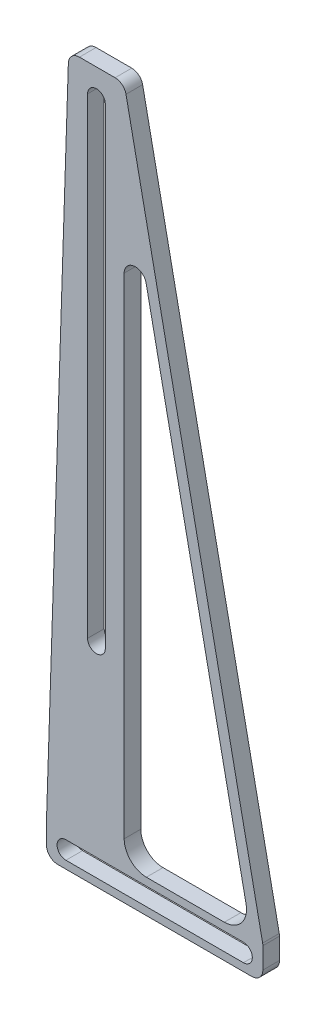
ISO-10303-21;
HEADER;
FILE_DESCRIPTION(('STEP AP214'),'2;1');
FILE_NAME('part.step','',(''),(''),'','','');
FILE_SCHEMA(('AUTOMOTIVE_DESIGN { 1 0 10303 214 1 1 1 1 }'));
ENDSEC;
DATA;
#1=APPLICATION_CONTEXT('core data for automotive mechanical design processes');
#2=APPLICATION_PROTOCOL_DEFINITION('international standard','automotive_design',2000,#1);
#3=PRODUCT_CONTEXT('',#1,'mechanical');
#4=PRODUCT('Part','Part','',(#3));
#5=PRODUCT_RELATED_PRODUCT_CATEGORY('part','',(#4));
#6=PRODUCT_DEFINITION_FORMATION('','',#4);
#7=PRODUCT_DEFINITION_CONTEXT('part definition',#1,'design');
#8=PRODUCT_DEFINITION('design','',#6,#7);
#9=PRODUCT_DEFINITION_SHAPE('','',#8);
#10=(LENGTH_UNIT() NAMED_UNIT(*) SI_UNIT(.MILLI.,.METRE.));
#11=(NAMED_UNIT(*) PLANE_ANGLE_UNIT() SI_UNIT($,.RADIAN.));
#12=(NAMED_UNIT(*) SI_UNIT($,.STERADIAN.) SOLID_ANGLE_UNIT());
#13=UNCERTAINTY_MEASURE_WITH_UNIT(LENGTH_MEASURE(1.E-05),#10,'distance_accuracy_value','');
#14=(GEOMETRIC_REPRESENTATION_CONTEXT(3) GLOBAL_UNCERTAINTY_ASSIGNED_CONTEXT((#13)) GLOBAL_UNIT_ASSIGNED_CONTEXT((#10,
#11,#12)) REPRESENTATION_CONTEXT('',''));
#15=CARTESIAN_POINT('',(0.,0.,0.));
#16=DIRECTION('',(0.,0.,1.));
#17=DIRECTION('',(1.,0.,0.));
#18=AXIS2_PLACEMENT_3D('',#15,#16,#17);
#19=CARTESIAN_POINT('',(0.,0.,3.));
#20=DIRECTION('',(0.,0.,1.));
#21=DIRECTION('',(1.,0.,0.));
#22=AXIS2_PLACEMENT_3D('',#19,#20,#21);
#23=PLANE('',#22);
#24=DIRECTION('',(-1.,0.,0.));
#25=VECTOR('',#24,1.);
#26=CARTESIAN_POINT('',(39.,6.,3.));
#27=LINE('',#26,#25);
#28=CARTESIAN_POINT('',(32.0556490686373,6.,3.));
#29=VERTEX_POINT('',#28);
#30=CARTESIAN_POINT('',(18.,6.,3.));
#31=VERTEX_POINT('',#30);
#32=EDGE_CURVE('E291',#29,#31,#27,.T.);
#33=ORIENTED_EDGE('',*,*,#32,.T.);
#34=CARTESIAN_POINT('',(18.,10.,3.));
#35=DIRECTION('',(0.,0.,1.));
#36=DIRECTION('',(1.,0.,0.));
#37=AXIS2_PLACEMENT_3D('',#34,#35,#36);
#38=CIRCLE('',#37,4.);
#39=CARTESIAN_POINT('',(14.,10.,3.));
#40=VERTEX_POINT('',#39);
#41=EDGE_CURVE('E377',#31,#40,#38,.F.);
#42=ORIENTED_EDGE('',*,*,#41,.T.);
#43=DIRECTION('',(0.,1.,0.));
#44=VECTOR('',#43,1.);
#45=CARTESIAN_POINT('',(14.,6.00000000000001,3.));
#46=LINE('',#45,#44);
#47=CARTESIAN_POINT('',(14.,98.3143783033,3.));
#48=VERTEX_POINT('',#47);
#49=EDGE_CURVE('E294',#40,#48,#46,.T.);
#50=ORIENTED_EDGE('',*,*,#49,.T.);
#51=CARTESIAN_POINT('',(16.,98.3143783033,3.));
#52=DIRECTION('',(0.,0.,1.));
#53=DIRECTION('',(1.,0.,0.));
#54=AXIS2_PLACEMENT_3D('',#51,#52,#53);
#55=CIRCLE('',#54,2.);
#56=CARTESIAN_POINT('',(17.9592864199798,98.7158714221483,3.));
#57=VERTEX_POINT('',#56);
#58=EDGE_CURVE('E356',#48,#57,#55,.F.);
#59=ORIENTED_EDGE('',*,*,#58,.T.);
#60=DIRECTION('',(0.200746559424165,-0.979643209989923,0.));
#61=VECTOR('',#60,1.);
#62=CARTESIAN_POINT('',(36.9584403999283,6.,3.));
#63=LINE('',#62,#61);
#64=CARTESIAN_POINT('',(35.974221908597,10.8029862376967,3.));
#65=VERTEX_POINT('',#64);
#66=EDGE_CURVE('E425',#57,#65,#63,.T.);
#67=ORIENTED_EDGE('',*,*,#66,.T.);
#68=CARTESIAN_POINT('',(32.0556490686373,10.,3.));
#69=DIRECTION('',(0.,0.,1.));
#70=DIRECTION('',(1.,0.,0.));
#71=AXIS2_PLACEMENT_3D('',#68,#69,#70);
#72=CIRCLE('',#71,4.);
#73=EDGE_CURVE('E371',#65,#29,#72,.F.);
#74=ORIENTED_EDGE('',*,*,#73,.T.);
#75=EDGE_LOOP('',(#33,#42,#50,#59,#67,#74));
#76=FACE_BOUND('',#75,.T.);
#77=DIRECTION('',(0.,-1.,0.));
#78=VECTOR('',#77,1.);
#79=CARTESIAN_POINT('',(0.,6.,3.));
#80=LINE('',#79,#78);
#81=CARTESIAN_POINT('',(0.,5.96722192133148,3.));
#82=VERTEX_POINT('',#81);
#83=CARTESIAN_POINT('',(0.,2.,3.));
#84=VERTEX_POINT('',#83);
#85=EDGE_CURVE('E284',#82,#84,#80,.T.);
#86=ORIENTED_EDGE('',*,*,#85,.T.);
#87=CARTESIAN_POINT('',(2.,2.,3.));
#88=DIRECTION('',(0.,0.,1.));
#89=DIRECTION('',(1.,0.,0.));
#90=AXIS2_PLACEMENT_3D('',#87,#88,#89);
#91=CIRCLE('',#90,2.);
#92=CARTESIAN_POINT('',(2.,0.,3.));
#93=VERTEX_POINT('',#92);
#94=EDGE_CURVE('E41',#84,#93,#91,.T.);
#95=ORIENTED_EDGE('',*,*,#94,.T.);
#96=DIRECTION('',(1.,0.,0.));
#97=VECTOR('',#96,1.);
#98=CARTESIAN_POINT('',(0.,0.,3.));
#99=LINE('',#98,#97);
#100=CARTESIAN_POINT('',(37.,0.,3.));
#101=VERTEX_POINT('',#100);
#102=EDGE_CURVE('E286',#93,#101,#99,.T.);
#103=ORIENTED_EDGE('',*,*,#102,.T.);
#104=CARTESIAN_POINT('',(37.,2.,3.));
#105=DIRECTION('',(0.,0.,1.));
#106=DIRECTION('',(1.,0.,0.));
#107=AXIS2_PLACEMENT_3D('',#104,#105,#106);
#108=CIRCLE('',#107,2.);
#109=CARTESIAN_POINT('',(39.,2.,3.));
#110=VERTEX_POINT('',#109);
#111=EDGE_CURVE('E48',#101,#110,#108,.T.);
#112=ORIENTED_EDGE('',*,*,#111,.T.);
#113=DIRECTION('',(0.,1.,0.));
#114=VECTOR('',#113,1.);
#115=CARTESIAN_POINT('',(39.,0.,3.));
#116=LINE('',#115,#114);
#117=CARTESIAN_POINT('',(39.,5.79718915165005,3.));
#118=VERTEX_POINT('',#117);
#119=EDGE_CURVE('E289',#110,#118,#116,.T.);
#120=ORIENTED_EDGE('',*,*,#119,.T.);
#121=CARTESIAN_POINT('',(37.,5.79718915165005,3.));
#122=DIRECTION('',(0.,0.,1.));
#123=DIRECTION('',(1.,0.,0.));
#124=AXIS2_PLACEMENT_3D('',#121,#122,#123);
#125=CIRCLE('',#124,2.);
#126=CARTESIAN_POINT('',(38.9592864199798,6.19868227049841,3.));
#127=VERTEX_POINT('',#126);
#128=EDGE_CURVE('E333',#118,#127,#125,.T.);
#129=ORIENTED_EDGE('',*,*,#128,.T.);
#130=DIRECTION('',(-0.200746559424165,0.979643209989923,0.));
#131=VECTOR('',#130,1.);
#132=CARTESIAN_POINT('',(14.,128.,3.));
#133=LINE('',#132,#131);
#134=CARTESIAN_POINT('',(14.3275628854819,126.401493118848,3.));
#135=VERTEX_POINT('',#134);
#136=EDGE_CURVE('E422',#127,#135,#133,.T.);
#137=ORIENTED_EDGE('',*,*,#136,.T.);
#138=CARTESIAN_POINT('',(12.3682764655021,126.,3.));
#139=DIRECTION('',(0.,0.,1.));
#140=DIRECTION('',(1.,0.,0.));
#141=AXIS2_PLACEMENT_3D('',#138,#139,#140);
#142=CIRCLE('',#141,2.);
#143=CARTESIAN_POINT('',(12.3682764655021,128.,3.));
#144=VERTEX_POINT('',#143);
#145=EDGE_CURVE('E337',#135,#144,#142,.T.);
#146=ORIENTED_EDGE('',*,*,#145,.T.);
#147=DIRECTION('',(-1.,0.,0.));
#148=VECTOR('',#147,1.);
#149=CARTESIAN_POINT('',(14.,128.,3.));
#150=LINE('',#149,#148);
#151=CARTESIAN_POINT('',(5.93550092061208,128.,3.));
#152=VERTEX_POINT('',#151);
#153=EDGE_CURVE('E296',#144,#152,#150,.T.);
#154=ORIENTED_EDGE('',*,*,#153,.T.);
#155=CARTESIAN_POINT('',(5.93550092061208,126.,3.));
#156=DIRECTION('',(0.,0.,1.));
#157=DIRECTION('',(1.,0.,0.));
#158=AXIS2_PLACEMENT_3D('',#155,#156,#157);
#159=CIRCLE('',#158,2.);
#160=CARTESIAN_POINT('',(3.93657503454562,126.065538553642,3.));
#161=VERTEX_POINT('',#160);
#162=EDGE_CURVE('E335',#152,#161,#159,.T.);
#163=ORIENTED_EDGE('',*,*,#162,.T.);
#164=DIRECTION('',(-0.0327692768207616,-0.999462943033229,0.));
#165=VECTOR('',#164,1.);
#166=CARTESIAN_POINT('',(0.,6.,3.));
#167=LINE('',#166,#165);
#168=CARTESIAN_POINT('',(0.00107411393354302,6.03276047497301,3.));
#169=VERTEX_POINT('',#168);
#170=EDGE_CURVE('E416',#161,#169,#167,.T.);
#171=ORIENTED_EDGE('',*,*,#170,.T.);
#172=CARTESIAN_POINT('',(2.,5.96722192133148,3.));
#173=DIRECTION('',(0.,0.,1.));
#174=DIRECTION('',(1.,0.,0.));
#175=AXIS2_PLACEMENT_3D('',#172,#173,#174);
#176=CIRCLE('',#175,2.);
#177=EDGE_CURVE('E331',#169,#82,#176,.T.);
#178=ORIENTED_EDGE('',*,*,#177,.T.);
#179=EDGE_LOOP('',(#86,#95,#103,#112,#120,#129,#137,#146,#154,#163,#171,#178));
#180=FACE_BOUND('',#179,.T.);
#181=DIRECTION('',(1.,0.,0.));
#182=VECTOR('',#181,1.);
#183=CARTESIAN_POINT('',(3.5,1.4,3.));
#184=LINE('',#183,#182);
#185=CARTESIAN_POINT('',(3.5,1.4,3.));
#186=VERTEX_POINT('',#185);
#187=CARTESIAN_POINT('',(35.5,1.4,3.));
#188=VERTEX_POINT('',#187);
#189=EDGE_CURVE('E255',#186,#188,#184,.T.);
#190=ORIENTED_EDGE('',*,*,#189,.F.);
#191=CARTESIAN_POINT('',(3.5,3.,3.));
#192=DIRECTION('',(0.,0.,1.));
#193=DIRECTION('',(1.,0.,0.));
#194=AXIS2_PLACEMENT_3D('',#191,#192,#193);
#195=CIRCLE('',#194,1.6);
#196=CARTESIAN_POINT('',(3.5,4.6,3.));
#197=VERTEX_POINT('',#196);
#198=EDGE_CURVE('E253',#197,#186,#195,.T.);
#199=ORIENTED_EDGE('',*,*,#198,.F.);
#200=DIRECTION('',(-1.,0.,0.));
#201=VECTOR('',#200,1.);
#202=CARTESIAN_POINT('',(3.5,4.6,3.));
#203=LINE('',#202,#201);
#204=CARTESIAN_POINT('',(35.5,4.6,3.));
#205=VERTEX_POINT('',#204);
#206=EDGE_CURVE('E261',#205,#197,#203,.T.);
#207=ORIENTED_EDGE('',*,*,#206,.F.);
#208=CARTESIAN_POINT('',(35.5,3.,3.));
#209=DIRECTION('',(0.,0.,1.));
#210=DIRECTION('',(1.,0.,0.));
#211=AXIS2_PLACEMENT_3D('',#208,#209,#210);
#212=CIRCLE('',#211,1.6);
#213=EDGE_CURVE('E258',#188,#205,#212,.T.);
#214=ORIENTED_EDGE('',*,*,#213,.F.);
#215=EDGE_LOOP('',(#190,#199,#207,#214));
#216=FACE_BOUND('',#215,.T.);
#217=DIRECTION('',(0.,1.,0.));
#218=VECTOR('',#217,1.);
#219=CARTESIAN_POINT('',(10.6,38.,3.));
#220=LINE('',#219,#218);
#221=CARTESIAN_POINT('',(10.6,38.,3.));
#222=VERTEX_POINT('',#221);
#223=CARTESIAN_POINT('',(10.6,123.,3.));
#224=VERTEX_POINT('',#223);
#225=EDGE_CURVE('E220',#222,#224,#220,.T.);
#226=ORIENTED_EDGE('',*,*,#225,.F.);
#227=CARTESIAN_POINT('',(9.,38.,3.));
#228=DIRECTION('',(0.,0.,1.));
#229=DIRECTION('',(1.,0.,0.));
#230=AXIS2_PLACEMENT_3D('',#227,#228,#229);
#231=CIRCLE('',#230,1.6);
#232=CARTESIAN_POINT('',(7.4,38.,3.));
#233=VERTEX_POINT('',#232);
#234=EDGE_CURVE('E210',#233,#222,#231,.T.);
#235=ORIENTED_EDGE('',*,*,#234,.F.);
#236=DIRECTION('',(0.,-1.,0.));
#237=VECTOR('',#236,1.);
#238=CARTESIAN_POINT('',(7.4,38.,3.));
#239=LINE('',#238,#237);
#240=CARTESIAN_POINT('',(7.4,123.,3.));
#241=VERTEX_POINT('',#240);
#242=EDGE_CURVE('E235',#241,#233,#239,.T.);
#243=ORIENTED_EDGE('',*,*,#242,.F.);
#244=CARTESIAN_POINT('',(9.,123.,3.));
#245=DIRECTION('',(0.,0.,1.));
#246=DIRECTION('',(1.,0.,0.));
#247=AXIS2_PLACEMENT_3D('',#244,#245,#246);
#248=CIRCLE('',#247,1.6);
#249=EDGE_CURVE('E233',#224,#241,#248,.T.);
#250=ORIENTED_EDGE('',*,*,#249,.F.);
#251=EDGE_LOOP('',(#226,#235,#243,#250));
#252=FACE_BOUND('',#251,.T.);
#253=ADVANCED_FACE('F33',(#76,#180,#216,#252),#23,.T.);
#254=CARTESIAN_POINT('',(0.,0.,0.));
#255=DIRECTION('',(0.,0.,1.));
#256=DIRECTION('',(1.,0.,0.));
#257=AXIS2_PLACEMENT_3D('',#254,#255,#256);
#258=PLANE('',#257);
#259=DIRECTION('',(-1.,0.,0.));
#260=VECTOR('',#259,1.);
#261=CARTESIAN_POINT('',(39.,6.,0.));
#262=LINE('',#261,#260);
#263=CARTESIAN_POINT('',(32.0556490686373,6.,0.));
#264=VERTEX_POINT('',#263);
#265=CARTESIAN_POINT('',(18.,6.,0.));
#266=VERTEX_POINT('',#265);
#267=EDGE_CURVE('E306',#264,#266,#262,.T.);
#268=ORIENTED_EDGE('',*,*,#267,.F.);
#269=CARTESIAN_POINT('',(32.0556490686373,10.,0.));
#270=DIRECTION('',(0.,0.,1.));
#271=DIRECTION('',(1.,0.,0.));
#272=AXIS2_PLACEMENT_3D('',#269,#270,#271);
#273=CIRCLE('',#272,4.);
#274=CARTESIAN_POINT('',(35.974221908597,10.8029862376967,0.));
#275=VERTEX_POINT('',#274);
#276=EDGE_CURVE('E373',#264,#275,#273,.T.);
#277=ORIENTED_EDGE('',*,*,#276,.T.);
#278=DIRECTION('',(-0.200746559424165,0.979643209989923,0.));
#279=VECTOR('',#278,1.);
#280=CARTESIAN_POINT('',(36.9584403999283,6.,0.));
#281=LINE('',#280,#279);
#282=CARTESIAN_POINT('',(17.9592864199798,98.7158714221483,0.));
#283=VERTEX_POINT('',#282);
#284=EDGE_CURVE('E418',#275,#283,#281,.T.);
#285=ORIENTED_EDGE('',*,*,#284,.T.);
#286=CARTESIAN_POINT('',(16.,98.3143783033,0.));
#287=DIRECTION('',(0.,0.,1.));
#288=DIRECTION('',(1.,0.,0.));
#289=AXIS2_PLACEMENT_3D('',#286,#287,#288);
#290=CIRCLE('',#289,2.);
#291=CARTESIAN_POINT('',(14.,98.3143783033,0.));
#292=VERTEX_POINT('',#291);
#293=EDGE_CURVE('E358',#283,#292,#290,.T.);
#294=ORIENTED_EDGE('',*,*,#293,.T.);
#295=DIRECTION('',(0.,1.,0.));
#296=VECTOR('',#295,1.);
#297=CARTESIAN_POINT('',(14.,6.00000000000001,0.));
#298=LINE('',#297,#296);
#299=CARTESIAN_POINT('',(14.,10.,0.));
#300=VERTEX_POINT('',#299);
#301=EDGE_CURVE('E309',#300,#292,#298,.T.);
#302=ORIENTED_EDGE('',*,*,#301,.F.);
#303=CARTESIAN_POINT('',(18.,10.,0.));
#304=DIRECTION('',(0.,0.,1.));
#305=DIRECTION('',(1.,0.,0.));
#306=AXIS2_PLACEMENT_3D('',#303,#304,#305);
#307=CIRCLE('',#306,4.);
#308=EDGE_CURVE('E375',#300,#266,#307,.T.);
#309=ORIENTED_EDGE('',*,*,#308,.T.);
#310=EDGE_LOOP('',(#268,#277,#285,#294,#302,#309));
#311=FACE_BOUND('',#310,.T.);
#312=CARTESIAN_POINT('',(3.5,3.,0.));
#313=DIRECTION('',(0.,0.,1.));
#314=DIRECTION('',(1.,0.,0.));
#315=AXIS2_PLACEMENT_3D('',#312,#313,#314);
#316=CIRCLE('',#315,1.6);
#317=CARTESIAN_POINT('',(3.5,4.6,0.));
#318=VERTEX_POINT('',#317);
#319=CARTESIAN_POINT('',(3.5,1.4,0.));
#320=VERTEX_POINT('',#319);
#321=EDGE_CURVE('E228',#318,#320,#316,.T.);
#322=ORIENTED_EDGE('',*,*,#321,.T.);
#323=DIRECTION('',(1.,0.,0.));
#324=VECTOR('',#323,1.);
#325=CARTESIAN_POINT('',(3.5,1.4,0.));
#326=LINE('',#325,#324);
#327=CARTESIAN_POINT('',(35.5,1.4,0.));
#328=VERTEX_POINT('',#327);
#329=EDGE_CURVE('E266',#320,#328,#326,.T.);
#330=ORIENTED_EDGE('',*,*,#329,.T.);
#331=CARTESIAN_POINT('',(35.5,3.,0.));
#332=DIRECTION('',(0.,0.,1.));
#333=DIRECTION('',(1.,0.,0.));
#334=AXIS2_PLACEMENT_3D('',#331,#332,#333);
#335=CIRCLE('',#334,1.6);
#336=CARTESIAN_POINT('',(35.5,4.6,0.));
#337=VERTEX_POINT('',#336);
#338=EDGE_CURVE('E269',#328,#337,#335,.T.);
#339=ORIENTED_EDGE('',*,*,#338,.T.);
#340=DIRECTION('',(-1.,0.,0.));
#341=VECTOR('',#340,1.);
#342=CARTESIAN_POINT('',(3.5,4.6,0.));
#343=LINE('',#342,#341);
#344=EDGE_CURVE('E256',#337,#318,#343,.T.);
#345=ORIENTED_EDGE('',*,*,#344,.T.);
#346=EDGE_LOOP('',(#322,#330,#339,#345));
#347=FACE_BOUND('',#346,.T.);
#348=DIRECTION('',(1.,0.,0.));
#349=VECTOR('',#348,1.);
#350=CARTESIAN_POINT('',(0.,0.,0.));
#351=LINE('',#350,#349);
#352=CARTESIAN_POINT('',(2.,0.,0.));
#353=VERTEX_POINT('',#352);
#354=CARTESIAN_POINT('',(37.,0.,0.));
#355=VERTEX_POINT('',#354);
#356=EDGE_CURVE('E301',#353,#355,#351,.T.);
#357=ORIENTED_EDGE('',*,*,#356,.F.);
#358=CARTESIAN_POINT('',(2.,2.,0.));
#359=DIRECTION('',(0.,0.,1.));
#360=DIRECTION('',(1.,0.,0.));
#361=AXIS2_PLACEMENT_3D('',#358,#359,#360);
#362=CIRCLE('',#361,2.);
#363=CARTESIAN_POINT('',(0.,2.,0.));
#364=VERTEX_POINT('',#363);
#365=EDGE_CURVE('E386',#353,#364,#362,.F.);
#366=ORIENTED_EDGE('',*,*,#365,.T.);
#367=DIRECTION('',(0.,-1.,0.));
#368=VECTOR('',#367,1.);
#369=CARTESIAN_POINT('',(0.,6.,0.));
#370=LINE('',#369,#368);
#371=CARTESIAN_POINT('',(0.,5.96722192133148,0.));
#372=VERTEX_POINT('',#371);
#373=EDGE_CURVE('E283',#372,#364,#370,.T.);
#374=ORIENTED_EDGE('',*,*,#373,.F.);
#375=CARTESIAN_POINT('',(2.,5.96722192133148,0.));
#376=DIRECTION('',(0.,0.,1.));
#377=DIRECTION('',(1.,0.,0.));
#378=AXIS2_PLACEMENT_3D('',#375,#376,#377);
#379=CIRCLE('',#378,2.);
#380=CARTESIAN_POINT('',(0.00107411393354302,6.03276047497301,0.));
#381=VERTEX_POINT('',#380);
#382=EDGE_CURVE('E317',#372,#381,#379,.F.);
#383=ORIENTED_EDGE('',*,*,#382,.T.);
#384=DIRECTION('',(0.0327692768207616,0.99946294303323,0.));
#385=VECTOR('',#384,1.);
#386=CARTESIAN_POINT('',(0.,6.,0.));
#387=LINE('',#386,#385);
#388=CARTESIAN_POINT('',(3.93657503454562,126.065538553642,0.));
#389=VERTEX_POINT('',#388);
#390=EDGE_CURVE('E242',#381,#389,#387,.T.);
#391=ORIENTED_EDGE('',*,*,#390,.T.);
#392=CARTESIAN_POINT('',(5.93550092061208,126.,0.));
#393=DIRECTION('',(0.,0.,1.));
#394=DIRECTION('',(1.,0.,0.));
#395=AXIS2_PLACEMENT_3D('',#392,#393,#394);
#396=CIRCLE('',#395,2.);
#397=CARTESIAN_POINT('',(5.93550092061208,128.,0.));
#398=VERTEX_POINT('',#397);
#399=EDGE_CURVE('E322',#389,#398,#396,.F.);
#400=ORIENTED_EDGE('',*,*,#399,.T.);
#401=DIRECTION('',(-1.,0.,0.));
#402=VECTOR('',#401,1.);
#403=CARTESIAN_POINT('',(14.,128.,0.));
#404=LINE('',#403,#402);
#405=CARTESIAN_POINT('',(12.3682764655021,128.,0.));
#406=VERTEX_POINT('',#405);
#407=EDGE_CURVE('E287',#406,#398,#404,.T.);
#408=ORIENTED_EDGE('',*,*,#407,.F.);
#409=CARTESIAN_POINT('',(12.3682764655021,126.,0.));
#410=DIRECTION('',(0.,0.,1.));
#411=DIRECTION('',(1.,0.,0.));
#412=AXIS2_PLACEMENT_3D('',#409,#410,#411);
#413=CIRCLE('',#412,2.);
#414=CARTESIAN_POINT('',(14.3275628854819,126.401493118848,0.));
#415=VERTEX_POINT('',#414);
#416=EDGE_CURVE('E324',#406,#415,#413,.F.);
#417=ORIENTED_EDGE('',*,*,#416,.T.);
#418=DIRECTION('',(0.200746559424165,-0.979643209989923,0.));
#419=VECTOR('',#418,1.);
#420=CARTESIAN_POINT('',(14.,128.,0.));
#421=LINE('',#420,#419);
#422=CARTESIAN_POINT('',(38.9592864199798,6.19868227049836,0.));
#423=VERTEX_POINT('',#422);
#424=EDGE_CURVE('E421',#415,#423,#421,.T.);
#425=ORIENTED_EDGE('',*,*,#424,.T.);
#426=CARTESIAN_POINT('',(37.,5.79718915165005,0.));
#427=DIRECTION('',(0.,0.,1.));
#428=DIRECTION('',(1.,0.,0.));
#429=AXIS2_PLACEMENT_3D('',#426,#427,#428);
#430=CIRCLE('',#429,2.);
#431=CARTESIAN_POINT('',(39.,5.79718915165005,0.));
#432=VERTEX_POINT('',#431);
#433=EDGE_CURVE('E319',#423,#432,#430,.F.);
#434=ORIENTED_EDGE('',*,*,#433,.T.);
#435=DIRECTION('',(0.,1.,0.));
#436=VECTOR('',#435,1.);
#437=CARTESIAN_POINT('',(39.,0.,0.));
#438=LINE('',#437,#436);
#439=CARTESIAN_POINT('',(39.,2.,0.));
#440=VERTEX_POINT('',#439);
#441=EDGE_CURVE('E304',#440,#432,#438,.T.);
#442=ORIENTED_EDGE('',*,*,#441,.F.);
#443=CARTESIAN_POINT('',(37.,2.,0.));
#444=DIRECTION('',(0.,0.,1.));
#445=DIRECTION('',(1.,0.,0.));
#446=AXIS2_PLACEMENT_3D('',#443,#444,#445);
#447=CIRCLE('',#446,2.);
#448=EDGE_CURVE('E384',#440,#355,#447,.F.);
#449=ORIENTED_EDGE('',*,*,#448,.T.);
#450=EDGE_LOOP('',(#357,#366,#374,#383,#391,#400,#408,#417,#425,#434,#442,#449));
#451=FACE_BOUND('',#450,.T.);
#452=CARTESIAN_POINT('',(9.,38.,0.));
#453=DIRECTION('',(0.,0.,1.));
#454=DIRECTION('',(1.,0.,0.));
#455=AXIS2_PLACEMENT_3D('',#452,#453,#454);
#456=CIRCLE('',#455,1.6);
#457=CARTESIAN_POINT('',(7.4,38.,0.));
#458=VERTEX_POINT('',#457);
#459=CARTESIAN_POINT('',(10.6,38.,0.));
#460=VERTEX_POINT('',#459);
#461=EDGE_CURVE('E240',#458,#460,#456,.T.);
#462=ORIENTED_EDGE('',*,*,#461,.T.);
#463=DIRECTION('',(0.,1.,0.));
#464=VECTOR('',#463,1.);
#465=CARTESIAN_POINT('',(10.6,38.,0.));
#466=LINE('',#465,#464);
#467=CARTESIAN_POINT('',(10.6,123.,0.));
#468=VERTEX_POINT('',#467);
#469=EDGE_CURVE('E227',#460,#468,#466,.T.);
#470=ORIENTED_EDGE('',*,*,#469,.T.);
#471=CARTESIAN_POINT('',(9.,123.,0.));
#472=DIRECTION('',(0.,0.,1.));
#473=DIRECTION('',(1.,0.,0.));
#474=AXIS2_PLACEMENT_3D('',#471,#472,#473);
#475=CIRCLE('',#474,1.6);
#476=CARTESIAN_POINT('',(7.4,123.,0.));
#477=VERTEX_POINT('',#476);
#478=EDGE_CURVE('E244',#468,#477,#475,.T.);
#479=ORIENTED_EDGE('',*,*,#478,.T.);
#480=DIRECTION('',(0.,-1.,0.));
#481=VECTOR('',#480,1.);
#482=CARTESIAN_POINT('',(7.4,38.,0.));
#483=LINE('',#482,#481);
#484=EDGE_CURVE('E221',#477,#458,#483,.T.);
#485=ORIENTED_EDGE('',*,*,#484,.T.);
#486=EDGE_LOOP('',(#462,#470,#479,#485));
#487=FACE_BOUND('',#486,.T.);
#488=ADVANCED_FACE('F401',(#311,#347,#451,#487),#258,.F.);
#489=CARTESIAN_POINT('',(0.,6.,3.));
#490=DIRECTION('',(1.,0.,0.));
#491=DIRECTION('',(0.,1.,0.));
#492=AXIS2_PLACEMENT_3D('',#489,#490,#491);
#493=PLANE('',#492);
#494=ORIENTED_EDGE('',*,*,#373,.T.);
#495=DIRECTION('',(0.,0.,-1.));
#496=VECTOR('',#495,1.);
#497=CARTESIAN_POINT('',(0.,2.,3.));
#498=LINE('',#497,#496);
#499=EDGE_CURVE('E56',#364,#84,#498,.F.);
#500=ORIENTED_EDGE('',*,*,#499,.T.);
#501=ORIENTED_EDGE('',*,*,#85,.F.);
#502=DIRECTION('',(0.,0.,-1.));
#503=VECTOR('',#502,1.);
#504=CARTESIAN_POINT('',(0.,5.96722192133148,0.));
#505=LINE('',#504,#503);
#506=EDGE_CURVE('E353',#82,#372,#505,.T.);
#507=ORIENTED_EDGE('',*,*,#506,.T.);
#508=EDGE_LOOP('',(#494,#500,#501,#507));
#509=FACE_BOUND('',#508,.T.);
#510=ADVANCED_FACE('F403',(#509),#493,.F.);
#511=CARTESIAN_POINT('',(0.,0.,3.));
#512=DIRECTION('',(0.,1.,0.));
#513=DIRECTION('',(0.,0.,1.));
#514=AXIS2_PLACEMENT_3D('',#511,#512,#513);
#515=PLANE('',#514);
#516=ORIENTED_EDGE('',*,*,#102,.F.);
#517=DIRECTION('',(0.,0.,-1.));
#518=VECTOR('',#517,1.);
#519=CARTESIAN_POINT('',(2.,0.,3.));
#520=LINE('',#519,#518);
#521=EDGE_CURVE('E381',#93,#353,#520,.T.);
#522=ORIENTED_EDGE('',*,*,#521,.T.);
#523=ORIENTED_EDGE('',*,*,#356,.T.);
#524=DIRECTION('',(0.,0.,-1.));
#525=VECTOR('',#524,1.);
#526=CARTESIAN_POINT('',(37.,0.,3.));
#527=LINE('',#526,#525);
#528=EDGE_CURVE('E379',#355,#101,#527,.F.);
#529=ORIENTED_EDGE('',*,*,#528,.T.);
#530=EDGE_LOOP('',(#516,#522,#523,#529));
#531=FACE_BOUND('',#530,.T.);
#532=ADVANCED_FACE('F395',(#531),#515,.F.);
#533=CARTESIAN_POINT('',(39.,0.,3.));
#534=DIRECTION('',(-1.,0.,0.));
#535=DIRECTION('',(0.,0.,1.));
#536=AXIS2_PLACEMENT_3D('',#533,#534,#535);
#537=PLANE('',#536);
#538=ORIENTED_EDGE('',*,*,#119,.F.);
#539=DIRECTION('',(0.,0.,-1.));
#540=VECTOR('',#539,1.);
#541=CARTESIAN_POINT('',(39.,2.,3.));
#542=LINE('',#541,#540);
#543=EDGE_CURVE('E11',#110,#440,#542,.T.);
#544=ORIENTED_EDGE('',*,*,#543,.T.);
#545=ORIENTED_EDGE('',*,*,#441,.T.);
#546=DIRECTION('',(0.,0.,-1.));
#547=VECTOR('',#546,1.);
#548=CARTESIAN_POINT('',(39.,5.79718915165005,3.));
#549=LINE('',#548,#547);
#550=EDGE_CURVE('E350',#432,#118,#549,.F.);
#551=ORIENTED_EDGE('',*,*,#550,.T.);
#552=EDGE_LOOP('',(#538,#544,#545,#551));
#553=FACE_BOUND('',#552,.T.);
#554=ADVANCED_FACE('F482',(#553),#537,.F.);
#555=CARTESIAN_POINT('',(39.,6.,3.));
#556=DIRECTION('',(0.,-1.,0.));
#557=DIRECTION('',(1.,0.,0.));
#558=AXIS2_PLACEMENT_3D('',#555,#556,#557);
#559=PLANE('',#558);
#560=ORIENTED_EDGE('',*,*,#32,.F.);
#561=DIRECTION('',(0.,0.,1.));
#562=VECTOR('',#561,1.);
#563=CARTESIAN_POINT('',(32.0556490686373,6.,3.));
#564=LINE('',#563,#562);
#565=EDGE_CURVE('E366',#29,#264,#564,.F.);
#566=ORIENTED_EDGE('',*,*,#565,.T.);
#567=ORIENTED_EDGE('',*,*,#267,.T.);
#568=DIRECTION('',(0.,0.,-1.));
#569=VECTOR('',#568,1.);
#570=CARTESIAN_POINT('',(18.,6.,3.));
#571=LINE('',#570,#569);
#572=EDGE_CURVE('E364',#266,#31,#571,.F.);
#573=ORIENTED_EDGE('',*,*,#572,.T.);
#574=EDGE_LOOP('',(#560,#566,#567,#573));
#575=FACE_BOUND('',#574,.T.);
#576=ADVANCED_FACE('F478',(#575),#559,.F.);
#577=CARTESIAN_POINT('',(14.,6.00000000000001,3.));
#578=DIRECTION('',(-1.,0.,0.));
#579=DIRECTION('',(0.,-1.,0.));
#580=AXIS2_PLACEMENT_3D('',#577,#578,#579);
#581=PLANE('',#580);
#582=ORIENTED_EDGE('',*,*,#49,.F.);
#583=DIRECTION('',(0.,0.,-1.));
#584=VECTOR('',#583,1.);
#585=CARTESIAN_POINT('',(14.,10.,0.));
#586=LINE('',#585,#584);
#587=EDGE_CURVE('E368',#40,#300,#586,.T.);
#588=ORIENTED_EDGE('',*,*,#587,.T.);
#589=ORIENTED_EDGE('',*,*,#301,.T.);
#590=DIRECTION('',(0.,0.,1.));
#591=VECTOR('',#590,1.);
#592=CARTESIAN_POINT('',(14.,98.3143783033,3.));
#593=LINE('',#592,#591);
#594=EDGE_CURVE('E344',#292,#48,#593,.T.);
#595=ORIENTED_EDGE('',*,*,#594,.T.);
#596=EDGE_LOOP('',(#582,#588,#589,#595));
#597=FACE_BOUND('',#596,.T.);
#598=ADVANCED_FACE('F475',(#597),#581,.F.);
#599=CARTESIAN_POINT('',(14.,128.,3.));
#600=DIRECTION('',(0.,-1.,0.));
#601=DIRECTION('',(0.,0.,-1.));
#602=AXIS2_PLACEMENT_3D('',#599,#600,#601);
#603=PLANE('',#602);
#604=ORIENTED_EDGE('',*,*,#153,.F.);
#605=DIRECTION('',(0.,0.,-1.));
#606=VECTOR('',#605,1.);
#607=CARTESIAN_POINT('',(12.3682764655021,128.,0.));
#608=LINE('',#607,#606);
#609=EDGE_CURVE('E314',#144,#406,#608,.T.);
#610=ORIENTED_EDGE('',*,*,#609,.T.);
#611=ORIENTED_EDGE('',*,*,#407,.T.);
#612=DIRECTION('',(0.,0.,-1.));
#613=VECTOR('',#612,1.);
#614=CARTESIAN_POINT('',(5.93550092061208,128.,3.));
#615=LINE('',#614,#613);
#616=EDGE_CURVE('E299',#398,#152,#615,.F.);
#617=ORIENTED_EDGE('',*,*,#616,.T.);
#618=EDGE_LOOP('',(#604,#610,#611,#617));
#619=FACE_BOUND('',#618,.T.);
#620=ADVANCED_FACE('F445',(#619),#603,.F.);
#621=CARTESIAN_POINT('',(3.5,3.,3.));
#622=DIRECTION('',(0.,0.,-1.));
#623=DIRECTION('',(-1.,0.,0.));
#624=AXIS2_PLACEMENT_3D('',#621,#622,#623);
#625=CYLINDRICAL_SURFACE('',#624,1.6);
#626=ORIENTED_EDGE('',*,*,#321,.F.);
#627=DIRECTION('',(0.,0.,-1.));
#628=VECTOR('',#627,1.);
#629=CARTESIAN_POINT('',(3.5,4.6,3.));
#630=LINE('',#629,#628);
#631=EDGE_CURVE('E263',#197,#318,#630,.T.);
#632=ORIENTED_EDGE('',*,*,#631,.F.);
#633=ORIENTED_EDGE('',*,*,#198,.T.);
#634=DIRECTION('',(0.,0.,-1.));
#635=VECTOR('',#634,1.);
#636=CARTESIAN_POINT('',(3.5,1.4,3.));
#637=LINE('',#636,#635);
#638=EDGE_CURVE('E280',#186,#320,#637,.T.);
#639=ORIENTED_EDGE('',*,*,#638,.T.);
#640=EDGE_LOOP('',(#626,#632,#633,#639));
#641=FACE_BOUND('',#640,.T.);
#642=ADVANCED_FACE('F470',(#641),#625,.F.);
#643=CARTESIAN_POINT('',(3.5,1.4,3.));
#644=DIRECTION('',(0.,1.,0.));
#645=DIRECTION('',(-1.,0.,0.));
#646=AXIS2_PLACEMENT_3D('',#643,#644,#645);
#647=PLANE('',#646);
#648=ORIENTED_EDGE('',*,*,#329,.F.);
#649=ORIENTED_EDGE('',*,*,#638,.F.);
#650=ORIENTED_EDGE('',*,*,#189,.T.);
#651=DIRECTION('',(0.,0.,-1.));
#652=VECTOR('',#651,1.);
#653=CARTESIAN_POINT('',(35.5,1.4,3.));
#654=LINE('',#653,#652);
#655=EDGE_CURVE('E278',#188,#328,#654,.T.);
#656=ORIENTED_EDGE('',*,*,#655,.T.);
#657=EDGE_LOOP('',(#648,#649,#650,#656));
#658=FACE_BOUND('',#657,.T.);
#659=ADVANCED_FACE('F525',(#658),#647,.T.);
#660=CARTESIAN_POINT('',(35.5,3.,3.));
#661=DIRECTION('',(0.,0.,-1.));
#662=DIRECTION('',(-1.,0.,0.));
#663=AXIS2_PLACEMENT_3D('',#660,#661,#662);
#664=CYLINDRICAL_SURFACE('',#663,1.6);
#665=ORIENTED_EDGE('',*,*,#338,.F.);
#666=ORIENTED_EDGE('',*,*,#655,.F.);
#667=ORIENTED_EDGE('',*,*,#213,.T.);
#668=DIRECTION('',(0.,0.,-1.));
#669=VECTOR('',#668,1.);
#670=CARTESIAN_POINT('',(35.5,4.6,3.));
#671=LINE('',#670,#669);
#672=EDGE_CURVE('E276',#205,#337,#671,.T.);
#673=ORIENTED_EDGE('',*,*,#672,.T.);
#674=EDGE_LOOP('',(#665,#666,#667,#673));
#675=FACE_BOUND('',#674,.T.);
#676=ADVANCED_FACE('F532',(#675),#664,.F.);
#677=CARTESIAN_POINT('',(3.5,4.6,3.));
#678=DIRECTION('',(0.,-1.,0.));
#679=DIRECTION('',(1.,0.,0.));
#680=AXIS2_PLACEMENT_3D('',#677,#678,#679);
#681=PLANE('',#680);
#682=ORIENTED_EDGE('',*,*,#344,.F.);
#683=ORIENTED_EDGE('',*,*,#672,.F.);
#684=ORIENTED_EDGE('',*,*,#206,.T.);
#685=ORIENTED_EDGE('',*,*,#631,.T.);
#686=EDGE_LOOP('',(#682,#683,#684,#685));
#687=FACE_BOUND('',#686,.T.);
#688=ADVANCED_FACE('F539',(#687),#681,.T.);
#689=CARTESIAN_POINT('',(9.,38.,3.));
#690=DIRECTION('',(0.,0.,-1.));
#691=DIRECTION('',(-1.,0.,0.));
#692=AXIS2_PLACEMENT_3D('',#689,#690,#691);
#693=CYLINDRICAL_SURFACE('',#692,1.6);
#694=ORIENTED_EDGE('',*,*,#461,.F.);
#695=DIRECTION('',(0.,0.,-1.));
#696=VECTOR('',#695,1.);
#697=CARTESIAN_POINT('',(7.4,38.,3.));
#698=LINE('',#697,#696);
#699=EDGE_CURVE('E216',#233,#458,#698,.T.);
#700=ORIENTED_EDGE('',*,*,#699,.F.);
#701=ORIENTED_EDGE('',*,*,#234,.T.);
#702=DIRECTION('',(0.,0.,-1.));
#703=VECTOR('',#702,1.);
#704=CARTESIAN_POINT('',(10.6,38.,3.));
#705=LINE('',#704,#703);
#706=EDGE_CURVE('E213',#222,#460,#705,.T.);
#707=ORIENTED_EDGE('',*,*,#706,.T.);
#708=EDGE_LOOP('',(#694,#700,#701,#707));
#709=FACE_BOUND('',#708,.T.);
#710=ADVANCED_FACE('F212',(#709),#693,.F.);
#711=CARTESIAN_POINT('',(10.6,38.,3.));
#712=DIRECTION('',(-1.,0.,0.));
#713=DIRECTION('',(0.,0.,1.));
#714=AXIS2_PLACEMENT_3D('',#711,#712,#713);
#715=PLANE('',#714);
#716=ORIENTED_EDGE('',*,*,#469,.F.);
#717=ORIENTED_EDGE('',*,*,#706,.F.);
#718=ORIENTED_EDGE('',*,*,#225,.T.);
#719=DIRECTION('',(0.,0.,-1.));
#720=VECTOR('',#719,1.);
#721=CARTESIAN_POINT('',(10.6,123.,3.));
#722=LINE('',#721,#720);
#723=EDGE_CURVE('E229',#224,#468,#722,.T.);
#724=ORIENTED_EDGE('',*,*,#723,.T.);
#725=EDGE_LOOP('',(#716,#717,#718,#724));
#726=FACE_BOUND('',#725,.T.);
#727=ADVANCED_FACE('F224',(#726),#715,.T.);
#728=CARTESIAN_POINT('',(9.,123.,3.));
#729=DIRECTION('',(0.,0.,-1.));
#730=DIRECTION('',(-1.,0.,0.));
#731=AXIS2_PLACEMENT_3D('',#728,#729,#730);
#732=CYLINDRICAL_SURFACE('',#731,1.6);
#733=ORIENTED_EDGE('',*,*,#478,.F.);
#734=ORIENTED_EDGE('',*,*,#723,.F.);
#735=ORIENTED_EDGE('',*,*,#249,.T.);
#736=DIRECTION('',(0.,0.,-1.));
#737=VECTOR('',#736,1.);
#738=CARTESIAN_POINT('',(7.4,123.,3.));
#739=LINE('',#738,#737);
#740=EDGE_CURVE('E250',#241,#477,#739,.T.);
#741=ORIENTED_EDGE('',*,*,#740,.T.);
#742=EDGE_LOOP('',(#733,#734,#735,#741));
#743=FACE_BOUND('',#742,.T.);
#744=ADVANCED_FACE('F560',(#743),#732,.F.);
#745=CARTESIAN_POINT('',(7.4,38.,3.));
#746=DIRECTION('',(1.,0.,0.));
#747=DIRECTION('',(0.,0.,-1.));
#748=AXIS2_PLACEMENT_3D('',#745,#746,#747);
#749=PLANE('',#748);
#750=ORIENTED_EDGE('',*,*,#484,.F.);
#751=ORIENTED_EDGE('',*,*,#740,.F.);
#752=ORIENTED_EDGE('',*,*,#242,.T.);
#753=ORIENTED_EDGE('',*,*,#699,.T.);
#754=EDGE_LOOP('',(#750,#751,#752,#753));
#755=FACE_BOUND('',#754,.T.);
#756=ADVANCED_FACE('F567',(#755),#749,.T.);
#757=CARTESIAN_POINT('',(0.,6.,-124.535135604375));
#758=DIRECTION('',(-0.999462943033229,0.0327692768207616,0.));
#759=DIRECTION('',(-0.0327692768207616,-0.99946294303323,0.));
#760=AXIS2_PLACEMENT_3D('',#757,#758,#759);
#761=PLANE('',#760);
#762=ORIENTED_EDGE('',*,*,#170,.F.);
#763=DIRECTION('',(0.,0.,-1.));
#764=VECTOR('',#763,1.);
#765=CARTESIAN_POINT('',(3.93657503454562,126.065538553642,0.));
#766=LINE('',#765,#764);
#767=EDGE_CURVE('E341',#161,#389,#766,.T.);
#768=ORIENTED_EDGE('',*,*,#767,.T.);
#769=ORIENTED_EDGE('',*,*,#390,.F.);
#770=DIRECTION('',(0.,0.,-1.));
#771=VECTOR('',#770,1.);
#772=CARTESIAN_POINT('',(0.00107411393354302,6.03276047497301,3.));
#773=LINE('',#772,#771);
#774=EDGE_CURVE('E339',#381,#169,#773,.F.);
#775=ORIENTED_EDGE('',*,*,#774,.T.);
#776=EDGE_LOOP('',(#762,#768,#769,#775));
#777=FACE_BOUND('',#776,.T.);
#778=ADVANCED_FACE('F413',(#777),#761,.T.);
#779=CARTESIAN_POINT('',(14.,128.,-124.535135604375));
#780=DIRECTION('',(0.979643209989923,0.200746559424165,0.));
#781=DIRECTION('',(-0.200746559424165,0.979643209989923,0.));
#782=AXIS2_PLACEMENT_3D('',#779,#780,#781);
#783=PLANE('',#782);
#784=ORIENTED_EDGE('',*,*,#424,.F.);
#785=DIRECTION('',(0.,0.,-1.));
#786=VECTOR('',#785,1.);
#787=CARTESIAN_POINT('',(14.3275628854819,126.401493118848,3.));
#788=LINE('',#787,#786);
#789=EDGE_CURVE('E329',#415,#135,#788,.F.);
#790=ORIENTED_EDGE('',*,*,#789,.T.);
#791=ORIENTED_EDGE('',*,*,#136,.F.);
#792=DIRECTION('',(0.,0.,-1.));
#793=VECTOR('',#792,1.);
#794=CARTESIAN_POINT('',(38.9592864199798,6.19868227049838,0.));
#795=LINE('',#794,#793);
#796=EDGE_CURVE('E326',#127,#423,#795,.T.);
#797=ORIENTED_EDGE('',*,*,#796,.T.);
#798=EDGE_LOOP('',(#784,#790,#791,#797));
#799=FACE_BOUND('',#798,.T.);
#800=ADVANCED_FACE('F435',(#799),#783,.T.);
#801=CARTESIAN_POINT('',(36.9584403999283,6.,-124.535135604375));
#802=DIRECTION('',(-0.979643209989923,-0.200746559424165,0.));
#803=DIRECTION('',(0.200746559424165,-0.979643209989923,0.));
#804=AXIS2_PLACEMENT_3D('',#801,#802,#803);
#805=PLANE('',#804);
#806=ORIENTED_EDGE('',*,*,#284,.F.);
#807=DIRECTION('',(0.,0.,1.));
#808=VECTOR('',#807,1.);
#809=CARTESIAN_POINT('',(35.974221908597,10.8029862376967,-124.535135604375));
#810=LINE('',#809,#808);
#811=EDGE_CURVE('E361',#275,#65,#810,.T.);
#812=ORIENTED_EDGE('',*,*,#811,.T.);
#813=ORIENTED_EDGE('',*,*,#66,.F.);
#814=DIRECTION('',(0.,0.,1.));
#815=VECTOR('',#814,1.);
#816=CARTESIAN_POINT('',(17.9592864199798,98.7158714221483,-124.535135604375));
#817=LINE('',#816,#815);
#818=EDGE_CURVE('E347',#57,#283,#817,.F.);
#819=ORIENTED_EDGE('',*,*,#818,.T.);
#820=EDGE_LOOP('',(#806,#812,#813,#819));
#821=FACE_BOUND('',#820,.T.);
#822=ADVANCED_FACE('F459',(#821),#805,.T.);
#823=CARTESIAN_POINT('',(12.3682764655021,126.,3.));
#824=DIRECTION('',(0.,0.,1.));
#825=DIRECTION('',(1.,0.,0.));
#826=AXIS2_PLACEMENT_3D('',#823,#824,#825);
#827=CYLINDRICAL_SURFACE('',#826,2.);
#828=ORIENTED_EDGE('',*,*,#145,.F.);
#829=ORIENTED_EDGE('',*,*,#789,.F.);
#830=ORIENTED_EDGE('',*,*,#416,.F.);
#831=ORIENTED_EDGE('',*,*,#609,.F.);
#832=EDGE_LOOP('',(#828,#829,#830,#831));
#833=FACE_BOUND('',#832,.T.);
#834=ADVANCED_FACE('F440',(#833),#827,.T.);
#835=CARTESIAN_POINT('',(5.93550092061208,126.,-124.535135604375));
#836=DIRECTION('',(0.,0.,1.));
#837=DIRECTION('',(1.,0.,0.));
#838=AXIS2_PLACEMENT_3D('',#835,#836,#837);
#839=CYLINDRICAL_SURFACE('',#838,2.);
#840=ORIENTED_EDGE('',*,*,#162,.F.);
#841=ORIENTED_EDGE('',*,*,#616,.F.);
#842=ORIENTED_EDGE('',*,*,#399,.F.);
#843=ORIENTED_EDGE('',*,*,#767,.F.);
#844=EDGE_LOOP('',(#840,#841,#842,#843));
#845=FACE_BOUND('',#844,.T.);
#846=ADVANCED_FACE('F448',(#845),#839,.T.);
#847=CARTESIAN_POINT('',(16.,98.3143783033,3.));
#848=DIRECTION('',(0.,0.,1.));
#849=DIRECTION('',(1.,0.,0.));
#850=AXIS2_PLACEMENT_3D('',#847,#848,#849);
#851=CYLINDRICAL_SURFACE('',#850,2.);
#852=ORIENTED_EDGE('',*,*,#293,.F.);
#853=ORIENTED_EDGE('',*,*,#818,.F.);
#854=ORIENTED_EDGE('',*,*,#58,.F.);
#855=ORIENTED_EDGE('',*,*,#594,.F.);
#856=EDGE_LOOP('',(#852,#853,#854,#855));
#857=FACE_BOUND('',#856,.T.);
#858=ADVANCED_FACE('F450',(#857),#851,.F.);
#859=CARTESIAN_POINT('',(37.,5.79718915165005,-124.535135604375));
#860=DIRECTION('',(0.,0.,1.));
#861=DIRECTION('',(1.,0.,0.));
#862=AXIS2_PLACEMENT_3D('',#859,#860,#861);
#863=CYLINDRICAL_SURFACE('',#862,2.);
#864=ORIENTED_EDGE('',*,*,#128,.F.);
#865=ORIENTED_EDGE('',*,*,#550,.F.);
#866=ORIENTED_EDGE('',*,*,#433,.F.);
#867=ORIENTED_EDGE('',*,*,#796,.F.);
#868=EDGE_LOOP('',(#864,#865,#866,#867));
#869=FACE_BOUND('',#868,.T.);
#870=ADVANCED_FACE('F456',(#869),#863,.T.);
#871=CARTESIAN_POINT('',(2.,5.96722192133148,3.));
#872=DIRECTION('',(0.,0.,1.));
#873=DIRECTION('',(1.,0.,0.));
#874=AXIS2_PLACEMENT_3D('',#871,#872,#873);
#875=CYLINDRICAL_SURFACE('',#874,2.);
#876=ORIENTED_EDGE('',*,*,#177,.F.);
#877=ORIENTED_EDGE('',*,*,#774,.F.);
#878=ORIENTED_EDGE('',*,*,#382,.F.);
#879=ORIENTED_EDGE('',*,*,#506,.F.);
#880=EDGE_LOOP('',(#876,#877,#878,#879));
#881=FACE_BOUND('',#880,.T.);
#882=ADVANCED_FACE('F407',(#881),#875,.T.);
#883=CARTESIAN_POINT('',(32.0556490686373,10.,-124.535135604375));
#884=DIRECTION('',(0.,0.,1.));
#885=DIRECTION('',(1.,0.,0.));
#886=AXIS2_PLACEMENT_3D('',#883,#884,#885);
#887=CYLINDRICAL_SURFACE('',#886,4.);
#888=ORIENTED_EDGE('',*,*,#276,.F.);
#889=ORIENTED_EDGE('',*,*,#565,.F.);
#890=ORIENTED_EDGE('',*,*,#73,.F.);
#891=ORIENTED_EDGE('',*,*,#811,.F.);
#892=EDGE_LOOP('',(#888,#889,#890,#891));
#893=FACE_BOUND('',#892,.T.);
#894=ADVANCED_FACE('F623',(#893),#887,.F.);
#895=CARTESIAN_POINT('',(18.,10.,3.));
#896=DIRECTION('',(0.,0.,1.));
#897=DIRECTION('',(1.,0.,0.));
#898=AXIS2_PLACEMENT_3D('',#895,#896,#897);
#899=CYLINDRICAL_SURFACE('',#898,4.);
#900=ORIENTED_EDGE('',*,*,#41,.F.);
#901=ORIENTED_EDGE('',*,*,#572,.F.);
#902=ORIENTED_EDGE('',*,*,#308,.F.);
#903=ORIENTED_EDGE('',*,*,#587,.F.);
#904=EDGE_LOOP('',(#900,#901,#902,#903));
#905=FACE_BOUND('',#904,.T.);
#906=ADVANCED_FACE('F632',(#905),#899,.F.);
#907=CARTESIAN_POINT('',(2.,2.,3.));
#908=DIRECTION('',(0.,0.,-1.));
#909=DIRECTION('',(-1.,0.,0.));
#910=AXIS2_PLACEMENT_3D('',#907,#908,#909);
#911=CYLINDRICAL_SURFACE('',#910,2.);
#912=ORIENTED_EDGE('',*,*,#94,.F.);
#913=ORIENTED_EDGE('',*,*,#499,.F.);
#914=ORIENTED_EDGE('',*,*,#365,.F.);
#915=ORIENTED_EDGE('',*,*,#521,.F.);
#916=EDGE_LOOP('',(#912,#913,#914,#915));
#917=FACE_BOUND('',#916,.T.);
#918=ADVANCED_FACE('F398',(#917),#911,.T.);
#919=CARTESIAN_POINT('',(37.,2.,3.));
#920=DIRECTION('',(0.,0.,-1.));
#921=DIRECTION('',(-1.,0.,0.));
#922=AXIS2_PLACEMENT_3D('',#919,#920,#921);
#923=CYLINDRICAL_SURFACE('',#922,2.);
#924=ORIENTED_EDGE('',*,*,#111,.F.);
#925=ORIENTED_EDGE('',*,*,#528,.F.);
#926=ORIENTED_EDGE('',*,*,#448,.F.);
#927=ORIENTED_EDGE('',*,*,#543,.F.);
#928=EDGE_LOOP('',(#924,#925,#926,#927));
#929=FACE_BOUND('',#928,.T.);
#930=ADVANCED_FACE('F35',(#929),#923,.T.);
#931=CLOSED_SHELL('',(#253,#488,#510,#532,#554,#576,#598,#620,#642,#659,#676,#688,#710,#727,
#744,#756,#778,#800,#822,#834,#846,#858,#870,#882,#894,#906,#918,#930));
#932=MANIFOLD_SOLID_BREP('B2',#931);
#933=ADVANCED_BREP_SHAPE_REPRESENTATION('',(#18,#932),#14);
#934=SHAPE_DEFINITION_REPRESENTATION(#9,#933);
ENDSEC;
END-ISO-10303-21;
